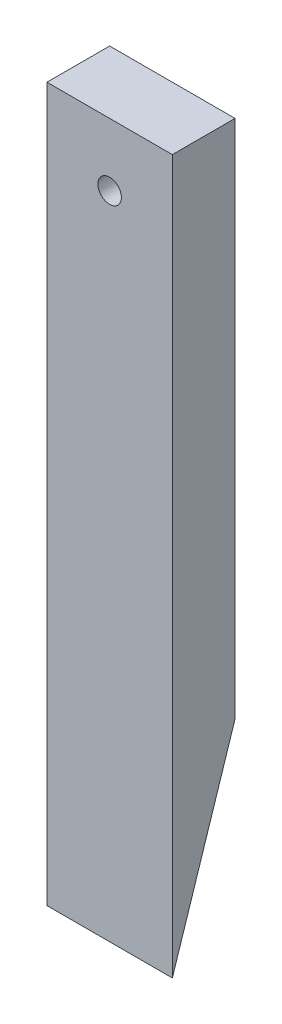
ISO-10303-21;
HEADER;
FILE_DESCRIPTION(('STEP AP214'),'2;1');
FILE_NAME('part.step','',(''),(''),'','','');
FILE_SCHEMA(('AUTOMOTIVE_DESIGN { 1 0 10303 214 1 1 1 1 }'));
ENDSEC;
DATA;
#1=APPLICATION_CONTEXT('core data for automotive mechanical design processes');
#2=APPLICATION_PROTOCOL_DEFINITION('international standard','automotive_design',2000,#1);
#3=PRODUCT_CONTEXT('',#1,'mechanical');
#4=PRODUCT('Part','Part','',(#3));
#5=PRODUCT_RELATED_PRODUCT_CATEGORY('part','',(#4));
#6=PRODUCT_DEFINITION_FORMATION('','',#4);
#7=PRODUCT_DEFINITION_CONTEXT('part definition',#1,'design');
#8=PRODUCT_DEFINITION('design','',#6,#7);
#9=PRODUCT_DEFINITION_SHAPE('','',#8);
#10=(LENGTH_UNIT() NAMED_UNIT(*) SI_UNIT(.MILLI.,.METRE.));
#11=(NAMED_UNIT(*) PLANE_ANGLE_UNIT() SI_UNIT($,.RADIAN.));
#12=(NAMED_UNIT(*) SI_UNIT($,.STERADIAN.) SOLID_ANGLE_UNIT());
#13=UNCERTAINTY_MEASURE_WITH_UNIT(LENGTH_MEASURE(1.E-05),#10,'distance_accuracy_value','');
#14=(GEOMETRIC_REPRESENTATION_CONTEXT(3) GLOBAL_UNCERTAINTY_ASSIGNED_CONTEXT((#13)) GLOBAL_UNIT_ASSIGNED_CONTEXT((#10,
#11,#12)) REPRESENTATION_CONTEXT('',''));
#15=CARTESIAN_POINT('',(0.,0.,0.));
#16=DIRECTION('',(0.,0.,1.));
#17=DIRECTION('',(1.,0.,0.));
#18=AXIS2_PLACEMENT_3D('',#15,#16,#17);
#19=CARTESIAN_POINT('',(24.,-136.5,24.));
#20=DIRECTION('',(-1.,0.,0.));
#21=DIRECTION('',(0.,0.,1.));
#22=AXIS2_PLACEMENT_3D('',#19,#20,#21);
#23=PLANE('',#22);
#24=DIRECTION('',(0.,1.,0.));
#25=VECTOR('',#24,1.);
#26=CARTESIAN_POINT('',(24.,-136.5,24.));
#27=LINE('',#26,#25);
#28=CARTESIAN_POINT('',(24.,-136.5,24.));
#29=VERTEX_POINT('',#28);
#30=CARTESIAN_POINT('',(24.,136.5,24.));
#31=VERTEX_POINT('',#30);
#32=EDGE_CURVE('E100',#29,#31,#27,.T.);
#33=ORIENTED_EDGE('',*,*,#32,.F.);
#34=DIRECTION('',(0.,-0.951056516295154,0.309016994374945));
#35=VECTOR('',#34,1.);
#36=CARTESIAN_POINT('',(24.,-136.5,24.));
#37=LINE('',#36,#35);
#38=CARTESIAN_POINT('',(24.,-62.6355951077932,0.));
#39=VERTEX_POINT('',#38);
#40=EDGE_CURVE('E117',#39,#29,#37,.T.);
#41=ORIENTED_EDGE('',*,*,#40,.F.);
#42=DIRECTION('',(0.,1.,0.));
#43=VECTOR('',#42,1.);
#44=CARTESIAN_POINT('',(24.,-136.5,0.));
#45=LINE('',#44,#43);
#46=CARTESIAN_POINT('',(24.,136.5,0.));
#47=VERTEX_POINT('',#46);
#48=EDGE_CURVE('E89',#39,#47,#45,.T.);
#49=ORIENTED_EDGE('',*,*,#48,.T.);
#50=DIRECTION('',(0.,0.,-1.));
#51=VECTOR('',#50,1.);
#52=CARTESIAN_POINT('',(24.,136.5,24.));
#53=LINE('',#52,#51);
#54=EDGE_CURVE('E11',#31,#47,#53,.T.);
#55=ORIENTED_EDGE('',*,*,#54,.F.);
#56=EDGE_LOOP('',(#33,#41,#49,#55));
#57=FACE_BOUND('',#56,.T.);
#58=ADVANCED_FACE('F43',(#57),#23,.F.);
#59=CARTESIAN_POINT('',(-24.,136.5,24.));
#60=DIRECTION('',(0.,-1.,0.));
#61=DIRECTION('',(0.,0.,-1.));
#62=AXIS2_PLACEMENT_3D('',#59,#60,#61);
#63=PLANE('',#62);
#64=DIRECTION('',(-1.,0.,0.));
#65=VECTOR('',#64,1.);
#66=CARTESIAN_POINT('',(-24.,136.5,0.));
#67=LINE('',#66,#65);
#68=CARTESIAN_POINT('',(-24.,136.5,0.));
#69=VERTEX_POINT('',#68);
#70=EDGE_CURVE('E79',#47,#69,#67,.T.);
#71=ORIENTED_EDGE('',*,*,#70,.T.);
#72=DIRECTION('',(0.,0.,-1.));
#73=VECTOR('',#72,1.);
#74=CARTESIAN_POINT('',(-24.,136.5,24.));
#75=LINE('',#74,#73);
#76=CARTESIAN_POINT('',(-24.,136.5,24.));
#77=VERTEX_POINT('',#76);
#78=EDGE_CURVE('E51',#77,#69,#75,.T.);
#79=ORIENTED_EDGE('',*,*,#78,.F.);
#80=DIRECTION('',(-1.,0.,0.));
#81=VECTOR('',#80,1.);
#82=CARTESIAN_POINT('',(-24.,136.5,24.));
#83=LINE('',#82,#81);
#84=EDGE_CURVE('E67',#31,#77,#83,.T.);
#85=ORIENTED_EDGE('',*,*,#84,.F.);
#86=ORIENTED_EDGE('',*,*,#54,.T.);
#87=EDGE_LOOP('',(#71,#79,#85,#86));
#88=FACE_BOUND('',#87,.T.);
#89=ADVANCED_FACE('F81',(#88),#63,.F.);
#90=CARTESIAN_POINT('',(-24.,-136.5,24.));
#91=DIRECTION('',(1.,0.,0.));
#92=DIRECTION('',(0.,0.,-1.));
#93=AXIS2_PLACEMENT_3D('',#90,#91,#92);
#94=PLANE('',#93);
#95=DIRECTION('',(0.,-1.,0.));
#96=VECTOR('',#95,1.);
#97=CARTESIAN_POINT('',(-24.,-136.5,0.));
#98=LINE('',#97,#96);
#99=CARTESIAN_POINT('',(-24.,-62.6355951077932,0.));
#100=VERTEX_POINT('',#99);
#101=EDGE_CURVE('E88',#69,#100,#98,.T.);
#102=ORIENTED_EDGE('',*,*,#101,.T.);
#103=DIRECTION('',(0.,-0.951056516295154,0.309016994374945));
#104=VECTOR('',#103,1.);
#105=CARTESIAN_POINT('',(-24.,-136.5,24.));
#106=LINE('',#105,#104);
#107=CARTESIAN_POINT('',(-24.,-136.5,24.));
#108=VERTEX_POINT('',#107);
#109=EDGE_CURVE('E58',#100,#108,#106,.T.);
#110=ORIENTED_EDGE('',*,*,#109,.T.);
#111=DIRECTION('',(0.,-1.,0.));
#112=VECTOR('',#111,1.);
#113=CARTESIAN_POINT('',(-24.,-136.5,24.));
#114=LINE('',#113,#112);
#115=EDGE_CURVE('E94',#77,#108,#114,.T.);
#116=ORIENTED_EDGE('',*,*,#115,.F.);
#117=ORIENTED_EDGE('',*,*,#78,.T.);
#118=EDGE_LOOP('',(#102,#110,#116,#117));
#119=FACE_BOUND('',#118,.T.);
#120=ADVANCED_FACE('F93',(#119),#94,.F.);
#121=CARTESIAN_POINT('',(0.,0.,24.));
#122=DIRECTION('',(0.,0.,-1.));
#123=DIRECTION('',(-1.,0.,0.));
#124=AXIS2_PLACEMENT_3D('',#121,#122,#123);
#125=PLANE('',#124);
#126=CARTESIAN_POINT('',(0.,112.5,24.));
#127=DIRECTION('',(0.,0.,1.));
#128=DIRECTION('',(1.,0.,0.));
#129=AXIS2_PLACEMENT_3D('',#126,#127,#128);
#130=CIRCLE('',#129,4.5);
#131=CARTESIAN_POINT('',(4.5,112.5,24.));
#132=VERTEX_POINT('',#131);
#133=EDGE_CURVE('E124',#132,#132,#130,.T.);
#134=ORIENTED_EDGE('',*,*,#133,.F.);
#135=EDGE_LOOP('',(#134));
#136=FACE_BOUND('',#135,.T.);
#137=ORIENTED_EDGE('',*,*,#32,.T.);
#138=ORIENTED_EDGE('',*,*,#84,.T.);
#139=ORIENTED_EDGE('',*,*,#115,.T.);
#140=DIRECTION('',(1.,0.,0.));
#141=VECTOR('',#140,1.);
#142=CARTESIAN_POINT('',(-24.,-136.5,24.));
#143=LINE('',#142,#141);
#144=EDGE_CURVE('E96',#108,#29,#143,.T.);
#145=ORIENTED_EDGE('',*,*,#144,.T.);
#146=EDGE_LOOP('',(#137,#138,#139,#145));
#147=FACE_BOUND('',#146,.T.);
#148=ADVANCED_FACE('F141',(#136,#147),#125,.F.);
#149=CARTESIAN_POINT('',(0.,0.,0.));
#150=DIRECTION('',(0.,0.,-1.));
#151=DIRECTION('',(-1.,0.,0.));
#152=AXIS2_PLACEMENT_3D('',#149,#150,#151);
#153=PLANE('',#152);
#154=CARTESIAN_POINT('',(0.,112.5,0.));
#155=DIRECTION('',(0.,0.,1.));
#156=DIRECTION('',(1.,0.,0.));
#157=AXIS2_PLACEMENT_3D('',#154,#155,#156);
#158=CIRCLE('',#157,4.5);
#159=CARTESIAN_POINT('',(4.5,112.5,0.));
#160=VERTEX_POINT('',#159);
#161=EDGE_CURVE('E121',#160,#160,#158,.T.);
#162=ORIENTED_EDGE('',*,*,#161,.T.);
#163=EDGE_LOOP('',(#162));
#164=FACE_BOUND('',#163,.T.);
#165=DIRECTION('',(1.,0.,0.));
#166=VECTOR('',#165,1.);
#167=CARTESIAN_POINT('',(-24.,-62.6355951077932,0.));
#168=LINE('',#167,#166);
#169=EDGE_CURVE('E98',#100,#39,#168,.T.);
#170=ORIENTED_EDGE('',*,*,#169,.F.);
#171=ORIENTED_EDGE('',*,*,#101,.F.);
#172=ORIENTED_EDGE('',*,*,#70,.F.);
#173=ORIENTED_EDGE('',*,*,#48,.F.);
#174=EDGE_LOOP('',(#170,#171,#172,#173));
#175=FACE_BOUND('',#174,.T.);
#176=ADVANCED_FACE('F97',(#164,#175),#153,.T.);
#177=CARTESIAN_POINT('',(-24.,-136.5,24.));
#178=DIRECTION('',(0.,0.309016994374945,0.951056516295154));
#179=DIRECTION('',(0.,-0.951056516295155,0.309016994374945));
#180=AXIS2_PLACEMENT_3D('',#177,#178,#179);
#181=PLANE('',#180);
#182=ORIENTED_EDGE('',*,*,#40,.T.);
#183=ORIENTED_EDGE('',*,*,#144,.F.);
#184=ORIENTED_EDGE('',*,*,#109,.F.);
#185=ORIENTED_EDGE('',*,*,#169,.T.);
#186=EDGE_LOOP('',(#182,#183,#184,#185));
#187=FACE_BOUND('',#186,.T.);
#188=ADVANCED_FACE('F137',(#187),#181,.F.);
#189=CARTESIAN_POINT('',(0.,112.5,0.));
#190=DIRECTION('',(0.,0.,1.));
#191=DIRECTION('',(1.,0.,0.));
#192=AXIS2_PLACEMENT_3D('',#189,#190,#191);
#193=CYLINDRICAL_SURFACE('',#192,4.5);
#194=ORIENTED_EDGE('',*,*,#161,.F.);
#195=EDGE_LOOP('',(#194));
#196=FACE_BOUND('',#195,.T.);
#197=ORIENTED_EDGE('',*,*,#133,.T.);
#198=EDGE_LOOP('',(#197));
#199=FACE_BOUND('',#198,.T.);
#200=ADVANCED_FACE('F134',(#196,#199),#193,.F.);
#201=CLOSED_SHELL('',(#58,#89,#120,#148,#176,#188,#200));
#202=MANIFOLD_SOLID_BREP('B2',#201);
#203=ADVANCED_BREP_SHAPE_REPRESENTATION('',(#18,#202),#14);
#204=SHAPE_DEFINITION_REPRESENTATION(#9,#203);
ENDSEC;
END-ISO-10303-21;
